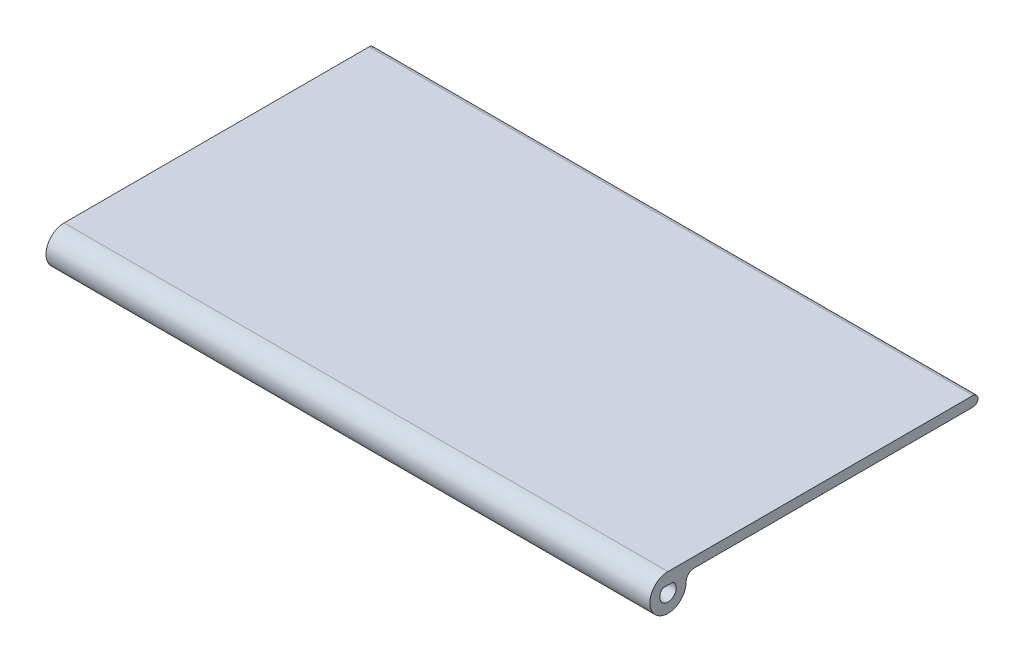
ISO-10303-21;
HEADER;
FILE_DESCRIPTION(('STEP AP214'),'2;1');
FILE_NAME('part.step','',(''),(''),'','','');
FILE_SCHEMA(('AUTOMOTIVE_DESIGN { 1 0 10303 214 1 1 1 1 }'));
ENDSEC;
DATA;
#1=APPLICATION_CONTEXT('core data for automotive mechanical design processes');
#2=APPLICATION_PROTOCOL_DEFINITION('international standard','automotive_design',2000,#1);
#3=PRODUCT_CONTEXT('',#1,'mechanical');
#4=PRODUCT('Part','Part','',(#3));
#5=PRODUCT_RELATED_PRODUCT_CATEGORY('part','',(#4));
#6=PRODUCT_DEFINITION_FORMATION('','',#4);
#7=PRODUCT_DEFINITION_CONTEXT('part definition',#1,'design');
#8=PRODUCT_DEFINITION('design','',#6,#7);
#9=PRODUCT_DEFINITION_SHAPE('','',#8);
#10=(LENGTH_UNIT() NAMED_UNIT(*) SI_UNIT(.MILLI.,.METRE.));
#11=(NAMED_UNIT(*) PLANE_ANGLE_UNIT() SI_UNIT($,.RADIAN.));
#12=(NAMED_UNIT(*) SI_UNIT($,.STERADIAN.) SOLID_ANGLE_UNIT());
#13=UNCERTAINTY_MEASURE_WITH_UNIT(LENGTH_MEASURE(1.E-05),#10,'distance_accuracy_value','');
#14=(GEOMETRIC_REPRESENTATION_CONTEXT(3) GLOBAL_UNCERTAINTY_ASSIGNED_CONTEXT((#13)) GLOBAL_UNIT_ASSIGNED_CONTEXT((#10,
#11,#12)) REPRESENTATION_CONTEXT('',''));
#15=CARTESIAN_POINT('',(0.,0.,0.));
#16=DIRECTION('',(0.,0.,1.));
#17=DIRECTION('',(1.,0.,0.));
#18=AXIS2_PLACEMENT_3D('',#15,#16,#17);
#19=CARTESIAN_POINT('',(300.,0.,0.));
#20=DIRECTION('',(1.,0.,0.));
#21=DIRECTION('',(0.,0.,-1.));
#22=AXIS2_PLACEMENT_3D('',#19,#20,#21);
#23=PLANE('',#22);
#24=CARTESIAN_POINT('',(300.,0.,0.));
#25=DIRECTION('',(1.,0.,0.));
#26=DIRECTION('',(0.,0.,-1.));
#27=AXIS2_PLACEMENT_3D('',#24,#25,#26);
#28=CIRCLE('',#27,4.1);
#29=CARTESIAN_POINT('',(300.,3.2,2.56320112359526));
#30=VERTEX_POINT('',#29);
#31=CARTESIAN_POINT('',(300.,3.2,-2.56320112359526));
#32=VERTEX_POINT('',#31);
#33=EDGE_CURVE('E141',#30,#32,#28,.T.);
#34=ORIENTED_EDGE('',*,*,#33,.F.);
#35=DIRECTION('',(0.,0.,1.));
#36=VECTOR('',#35,1.);
#37=CARTESIAN_POINT('',(300.,3.2,2.56320112359526));
#38=LINE('',#37,#36);
#39=EDGE_CURVE('E173',#32,#30,#38,.T.);
#40=ORIENTED_EDGE('',*,*,#39,.F.);
#41=EDGE_LOOP('',(#34,#40));
#42=FACE_BOUND('',#41,.T.);
#43=DIRECTION('',(0.,0.,-1.));
#44=VECTOR('',#43,1.);
#45=CARTESIAN_POINT('',(300.,4.,0.));
#46=LINE('',#45,#44);
#47=CARTESIAN_POINT('',(300.,4.,-13.));
#48=VERTEX_POINT('',#47);
#49=CARTESIAN_POINT('',(300.,4.,-151.5));
#50=VERTEX_POINT('',#49);
#51=EDGE_CURVE('E158',#48,#50,#46,.T.);
#52=ORIENTED_EDGE('',*,*,#51,.T.);
#53=CARTESIAN_POINT('',(300.,6.5,-151.5));
#54=DIRECTION('',(1.,0.,0.));
#55=DIRECTION('',(0.,0.,-1.));
#56=AXIS2_PLACEMENT_3D('',#53,#54,#55);
#57=CIRCLE('',#56,2.5);
#58=CARTESIAN_POINT('',(300.,9.,-151.5));
#59=VERTEX_POINT('',#58);
#60=EDGE_CURVE('E79',#50,#59,#57,.T.);
#61=ORIENTED_EDGE('',*,*,#60,.T.);
#62=DIRECTION('',(0.,0.,-1.));
#63=VECTOR('',#62,1.);
#64=CARTESIAN_POINT('',(300.,9.,0.));
#65=LINE('',#64,#63);
#66=CARTESIAN_POINT('',(300.,9.,0.));
#67=VERTEX_POINT('',#66);
#68=EDGE_CURVE('E217',#67,#59,#65,.T.);
#69=ORIENTED_EDGE('',*,*,#68,.F.);
#70=CARTESIAN_POINT('',(300.,0.,0.));
#71=DIRECTION('',(1.,0.,0.));
#72=DIRECTION('',(0.,0.,-1.));
#73=AXIS2_PLACEMENT_3D('',#70,#71,#72);
#74=CIRCLE('',#73,9.);
#75=CARTESIAN_POINT('',(300.,0.,-9.));
#76=VERTEX_POINT('',#75);
#77=EDGE_CURVE('E12',#67,#76,#74,.T.);
#78=ORIENTED_EDGE('',*,*,#77,.T.);
#79=CARTESIAN_POINT('',(300.,0.,-13.));
#80=DIRECTION('',(1.,0.,0.));
#81=DIRECTION('',(0.,0.,-1.));
#82=AXIS2_PLACEMENT_3D('',#79,#80,#81);
#83=CIRCLE('',#82,4.);
#84=EDGE_CURVE('E155',#76,#48,#83,.F.);
#85=ORIENTED_EDGE('',*,*,#84,.T.);
#86=EDGE_LOOP('',(#52,#61,#69,#78,#85));
#87=FACE_BOUND('',#86,.T.);
#88=ADVANCED_FACE('F75',(#42,#87),#23,.T.);
#89=CARTESIAN_POINT('',(0.,0.,0.));
#90=DIRECTION('',(1.,0.,0.));
#91=DIRECTION('',(0.,0.,-1.));
#92=AXIS2_PLACEMENT_3D('',#89,#90,#91);
#93=PLANE('',#92);
#94=DIRECTION('',(0.,0.,1.));
#95=VECTOR('',#94,1.);
#96=CARTESIAN_POINT('',(0.,3.2,2.56320112359526));
#97=LINE('',#96,#95);
#98=CARTESIAN_POINT('',(0.,3.2,-2.56320112359526));
#99=VERTEX_POINT('',#98);
#100=CARTESIAN_POINT('',(0.,3.2,2.56320112359526));
#101=VERTEX_POINT('',#100);
#102=EDGE_CURVE('E165',#99,#101,#97,.T.);
#103=ORIENTED_EDGE('',*,*,#102,.T.);
#104=CARTESIAN_POINT('',(0.,0.,0.));
#105=DIRECTION('',(1.,0.,0.));
#106=DIRECTION('',(0.,0.,-1.));
#107=AXIS2_PLACEMENT_3D('',#104,#105,#106);
#108=CIRCLE('',#107,4.1);
#109=EDGE_CURVE('E162',#101,#99,#108,.T.);
#110=ORIENTED_EDGE('',*,*,#109,.T.);
#111=EDGE_LOOP('',(#103,#110));
#112=FACE_BOUND('',#111,.T.);
#113=CARTESIAN_POINT('',(0.,6.5,-151.5));
#114=DIRECTION('',(1.,0.,0.));
#115=DIRECTION('',(0.,0.,-1.));
#116=AXIS2_PLACEMENT_3D('',#113,#114,#115);
#117=CIRCLE('',#116,2.5);
#118=CARTESIAN_POINT('',(0.,4.,-151.5));
#119=VERTEX_POINT('',#118);
#120=CARTESIAN_POINT('',(0.,9.,-151.5));
#121=VERTEX_POINT('',#120);
#122=EDGE_CURVE('E114',#119,#121,#117,.T.);
#123=ORIENTED_EDGE('',*,*,#122,.F.);
#124=DIRECTION('',(0.,0.,1.));
#125=VECTOR('',#124,1.);
#126=CARTESIAN_POINT('',(0.,4.,0.));
#127=LINE('',#126,#125);
#128=CARTESIAN_POINT('',(0.,4.,-13.));
#129=VERTEX_POINT('',#128);
#130=EDGE_CURVE('E147',#119,#129,#127,.T.);
#131=ORIENTED_EDGE('',*,*,#130,.T.);
#132=CARTESIAN_POINT('',(0.,0.,-13.));
#133=DIRECTION('',(1.,0.,0.));
#134=DIRECTION('',(0.,0.,-1.));
#135=AXIS2_PLACEMENT_3D('',#132,#133,#134);
#136=CIRCLE('',#135,4.);
#137=CARTESIAN_POINT('',(0.,0.,-9.));
#138=VERTEX_POINT('',#137);
#139=EDGE_CURVE('E144',#129,#138,#136,.T.);
#140=ORIENTED_EDGE('',*,*,#139,.T.);
#141=CARTESIAN_POINT('',(0.,0.,0.));
#142=DIRECTION('',(1.,0.,0.));
#143=DIRECTION('',(0.,0.,-1.));
#144=AXIS2_PLACEMENT_3D('',#141,#142,#143);
#145=CIRCLE('',#144,9.);
#146=CARTESIAN_POINT('',(0.,9.,0.));
#147=VERTEX_POINT('',#146);
#148=EDGE_CURVE('E85',#147,#138,#145,.T.);
#149=ORIENTED_EDGE('',*,*,#148,.F.);
#150=DIRECTION('',(0.,0.,1.));
#151=VECTOR('',#150,1.);
#152=CARTESIAN_POINT('',(0.,9.,0.));
#153=LINE('',#152,#151);
#154=EDGE_CURVE('E166',#121,#147,#153,.T.);
#155=ORIENTED_EDGE('',*,*,#154,.F.);
#156=EDGE_LOOP('',(#123,#131,#140,#149,#155));
#157=FACE_BOUND('',#156,.T.);
#158=ADVANCED_FACE('F145',(#112,#157),#93,.F.);
#159=CARTESIAN_POINT('',(-154.262762843144,4.,0.));
#160=DIRECTION('',(0.,-1.,0.));
#161=DIRECTION('',(0.,0.,-1.));
#162=AXIS2_PLACEMENT_3D('',#159,#160,#161);
#163=PLANE('',#162);
#164=ORIENTED_EDGE('',*,*,#130,.F.);
#165=DIRECTION('',(1.,0.,0.));
#166=VECTOR('',#165,1.);
#167=CARTESIAN_POINT('',(0.,4.,-151.5));
#168=LINE('',#167,#166);
#169=EDGE_CURVE('E213',#119,#50,#168,.T.);
#170=ORIENTED_EDGE('',*,*,#169,.T.);
#171=ORIENTED_EDGE('',*,*,#51,.F.);
#172=DIRECTION('',(1.,0.,0.));
#173=VECTOR('',#172,1.);
#174=CARTESIAN_POINT('',(-154.262762843144,4.,-13.));
#175=LINE('',#174,#173);
#176=EDGE_CURVE('E150',#129,#48,#175,.T.);
#177=ORIENTED_EDGE('',*,*,#176,.F.);
#178=EDGE_LOOP('',(#164,#170,#171,#177));
#179=FACE_BOUND('',#178,.T.);
#180=ADVANCED_FACE('F188',(#179),#163,.T.);
#181=CARTESIAN_POINT('',(-154.262762843144,9.,0.));
#182=DIRECTION('',(0.,-1.,0.));
#183=DIRECTION('',(0.,0.,-1.));
#184=AXIS2_PLACEMENT_3D('',#181,#182,#183);
#185=PLANE('',#184);
#186=DIRECTION('',(1.,0.,0.));
#187=VECTOR('',#186,1.);
#188=CARTESIAN_POINT('',(0.,9.,-151.5));
#189=LINE('',#188,#187);
#190=EDGE_CURVE('E105',#121,#59,#189,.T.);
#191=ORIENTED_EDGE('',*,*,#190,.F.);
#192=ORIENTED_EDGE('',*,*,#154,.T.);
#193=DIRECTION('',(1.,0.,0.));
#194=VECTOR('',#193,1.);
#195=CARTESIAN_POINT('',(-154.262762843144,9.,0.));
#196=LINE('',#195,#194);
#197=EDGE_CURVE('E140',#147,#67,#196,.T.);
#198=ORIENTED_EDGE('',*,*,#197,.T.);
#199=ORIENTED_EDGE('',*,*,#68,.T.);
#200=EDGE_LOOP('',(#191,#192,#198,#199));
#201=FACE_BOUND('',#200,.T.);
#202=ADVANCED_FACE('F193',(#201),#185,.F.);
#203=CARTESIAN_POINT('',(300.,0.,0.));
#204=DIRECTION('',(-1.,0.,0.));
#205=DIRECTION('',(0.,0.,1.));
#206=AXIS2_PLACEMENT_3D('',#203,#204,#205);
#207=CYLINDRICAL_SURFACE('',#206,9.);
#208=ORIENTED_EDGE('',*,*,#148,.T.);
#209=DIRECTION('',(1.,0.,0.));
#210=VECTOR('',#209,1.);
#211=CARTESIAN_POINT('',(-154.262762843144,0.,-9.));
#212=LINE('',#211,#210);
#213=EDGE_CURVE('E139',#138,#76,#212,.T.);
#214=ORIENTED_EDGE('',*,*,#213,.T.);
#215=ORIENTED_EDGE('',*,*,#77,.F.);
#216=ORIENTED_EDGE('',*,*,#197,.F.);
#217=EDGE_LOOP('',(#208,#214,#215,#216));
#218=FACE_BOUND('',#217,.T.);
#219=ADVANCED_FACE('F77',(#218),#207,.T.);
#220=CARTESIAN_POINT('',(0.,0.,0.));
#221=DIRECTION('',(1.,0.,0.));
#222=DIRECTION('',(0.,0.,-1.));
#223=AXIS2_PLACEMENT_3D('',#220,#221,#222);
#224=CYLINDRICAL_SURFACE('',#223,4.1);
#225=ORIENTED_EDGE('',*,*,#33,.T.);
#226=DIRECTION('',(1.,0.,0.));
#227=VECTOR('',#226,1.);
#228=CARTESIAN_POINT('',(0.,3.2,-2.56320112359526));
#229=LINE('',#228,#227);
#230=EDGE_CURVE('E169',#99,#32,#229,.T.);
#231=ORIENTED_EDGE('',*,*,#230,.F.);
#232=ORIENTED_EDGE('',*,*,#109,.F.);
#233=DIRECTION('',(1.,0.,0.));
#234=VECTOR('',#233,1.);
#235=CARTESIAN_POINT('',(0.,3.2,2.56320112359526));
#236=LINE('',#235,#234);
#237=EDGE_CURVE('E171',#101,#30,#236,.T.);
#238=ORIENTED_EDGE('',*,*,#237,.T.);
#239=EDGE_LOOP('',(#225,#231,#232,#238));
#240=FACE_BOUND('',#239,.T.);
#241=ADVANCED_FACE('F179',(#240),#224,.F.);
#242=CARTESIAN_POINT('',(0.,3.2,2.56320112359526));
#243=DIRECTION('',(0.,1.,0.));
#244=DIRECTION('',(0.,0.,1.));
#245=AXIS2_PLACEMENT_3D('',#242,#243,#244);
#246=PLANE('',#245);
#247=ORIENTED_EDGE('',*,*,#39,.T.);
#248=ORIENTED_EDGE('',*,*,#237,.F.);
#249=ORIENTED_EDGE('',*,*,#102,.F.);
#250=ORIENTED_EDGE('',*,*,#230,.T.);
#251=EDGE_LOOP('',(#247,#248,#249,#250));
#252=FACE_BOUND('',#251,.T.);
#253=ADVANCED_FACE('F185',(#252),#246,.F.);
#254=CARTESIAN_POINT('',(-154.262762843144,0.,-13.));
#255=DIRECTION('',(1.,0.,0.));
#256=DIRECTION('',(0.,0.,-1.));
#257=AXIS2_PLACEMENT_3D('',#254,#255,#256);
#258=CYLINDRICAL_SURFACE('',#257,4.);
#259=ORIENTED_EDGE('',*,*,#139,.F.);
#260=ORIENTED_EDGE('',*,*,#176,.T.);
#261=ORIENTED_EDGE('',*,*,#84,.F.);
#262=ORIENTED_EDGE('',*,*,#213,.F.);
#263=EDGE_LOOP('',(#259,#260,#261,#262));
#264=FACE_BOUND('',#263,.T.);
#265=ADVANCED_FACE('F153',(#264),#258,.F.);
#266=CARTESIAN_POINT('',(0.,6.5,-151.5));
#267=DIRECTION('',(1.,0.,0.));
#268=DIRECTION('',(0.,0.,-1.));
#269=AXIS2_PLACEMENT_3D('',#266,#267,#268);
#270=CYLINDRICAL_SURFACE('',#269,2.5);
#271=ORIENTED_EDGE('',*,*,#60,.F.);
#272=ORIENTED_EDGE('',*,*,#169,.F.);
#273=ORIENTED_EDGE('',*,*,#122,.T.);
#274=ORIENTED_EDGE('',*,*,#190,.T.);
#275=EDGE_LOOP('',(#271,#272,#273,#274));
#276=FACE_BOUND('',#275,.T.);
#277=ADVANCED_FACE('F206',(#276),#270,.T.);
#278=CLOSED_SHELL('',(#88,#158,#180,#202,#219,#241,#253,#265,#277));
#279=MANIFOLD_SOLID_BREP('B2',#278);
#280=ADVANCED_BREP_SHAPE_REPRESENTATION('',(#18,#279),#14);
#281=SHAPE_DEFINITION_REPRESENTATION(#9,#280);
ENDSEC;
END-ISO-10303-21;
